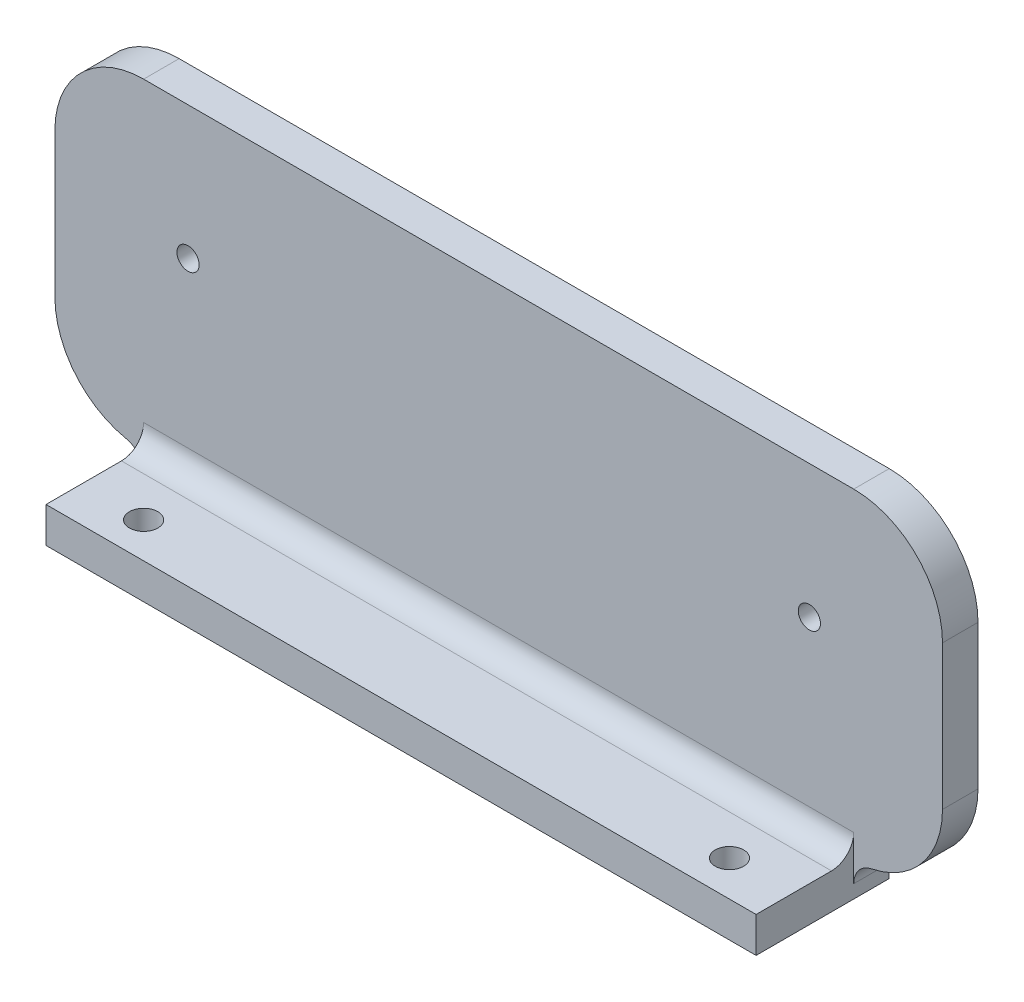
ISO-10303-21;
HEADER;
FILE_DESCRIPTION(('STEP AP214'),'2;1');
FILE_NAME('part.step','',(''),(''),'','','');
FILE_SCHEMA(('AUTOMOTIVE_DESIGN { 1 0 10303 214 1 1 1 1 }'));
ENDSEC;
DATA;
#1=APPLICATION_CONTEXT('core data for automotive mechanical design processes');
#2=APPLICATION_PROTOCOL_DEFINITION('international standard','automotive_design',2000,#1);
#3=PRODUCT_CONTEXT('',#1,'mechanical');
#4=PRODUCT('Part','Part','',(#3));
#5=PRODUCT_RELATED_PRODUCT_CATEGORY('part','',(#4));
#6=PRODUCT_DEFINITION_FORMATION('','',#4);
#7=PRODUCT_DEFINITION_CONTEXT('part definition',#1,'design');
#8=PRODUCT_DEFINITION('design','',#6,#7);
#9=PRODUCT_DEFINITION_SHAPE('','',#8);
#10=(LENGTH_UNIT() NAMED_UNIT(*) SI_UNIT(.MILLI.,.METRE.));
#11=(NAMED_UNIT(*) PLANE_ANGLE_UNIT() SI_UNIT($,.RADIAN.));
#12=(NAMED_UNIT(*) SI_UNIT($,.STERADIAN.) SOLID_ANGLE_UNIT());
#13=UNCERTAINTY_MEASURE_WITH_UNIT(LENGTH_MEASURE(1.E-05),#10,'distance_accuracy_value','');
#14=(GEOMETRIC_REPRESENTATION_CONTEXT(3) GLOBAL_UNCERTAINTY_ASSIGNED_CONTEXT((#13)) GLOBAL_UNIT_ASSIGNED_CONTEXT((#10,
#11,#12)) REPRESENTATION_CONTEXT('',''));
#15=CARTESIAN_POINT('',(0.,0.,0.));
#16=DIRECTION('',(0.,0.,1.));
#17=DIRECTION('',(1.,0.,0.));
#18=AXIS2_PLACEMENT_3D('',#15,#16,#17);
#19=CARTESIAN_POINT('',(50.,18.,4.));
#20=DIRECTION('',(-1.,0.,0.));
#21=DIRECTION('',(0.,-1.,0.));
#22=AXIS2_PLACEMENT_3D('',#19,#20,#21);
#23=PLANE('',#22);
#24=DIRECTION('',(0.,1.,0.));
#25=VECTOR('',#24,1.);
#26=CARTESIAN_POINT('',(50.,18.,4.));
#27=LINE('',#26,#25);
#28=CARTESIAN_POINT('',(50.,-8.2525512860841,4.));
#29=VERTEX_POINT('',#28);
#30=CARTESIAN_POINT('',(50.,7.99999999999999,4.));
#31=VERTEX_POINT('',#30);
#32=EDGE_CURVE('E173',#29,#31,#27,.T.);
#33=ORIENTED_EDGE('',*,*,#32,.F.);
#34=DIRECTION('',(0.,0.,-1.));
#35=VECTOR('',#34,1.);
#36=CARTESIAN_POINT('',(50.,-8.2525512860841,4.));
#37=LINE('',#36,#35);
#38=CARTESIAN_POINT('',(50.,-8.2525512860841,0.));
#39=VERTEX_POINT('',#38);
#40=EDGE_CURVE('E239',#29,#39,#37,.T.);
#41=ORIENTED_EDGE('',*,*,#40,.T.);
#42=DIRECTION('',(0.,1.,0.));
#43=VECTOR('',#42,1.);
#44=CARTESIAN_POINT('',(50.,18.,0.));
#45=LINE('',#44,#43);
#46=CARTESIAN_POINT('',(50.,7.99999999999999,0.));
#47=VERTEX_POINT('',#46);
#48=EDGE_CURVE('E164',#39,#47,#45,.T.);
#49=ORIENTED_EDGE('',*,*,#48,.T.);
#50=DIRECTION('',(0.,0.,-1.));
#51=VECTOR('',#50,1.);
#52=CARTESIAN_POINT('',(50.,7.99999999999999,4.));
#53=LINE('',#52,#51);
#54=EDGE_CURVE('E237',#47,#31,#53,.F.);
#55=ORIENTED_EDGE('',*,*,#54,.T.);
#56=EDGE_LOOP('',(#33,#41,#49,#55));
#57=FACE_BOUND('',#56,.T.);
#58=ADVANCED_FACE('F32',(#57),#23,.F.);
#59=CARTESIAN_POINT('',(-50.,18.,4.));
#60=DIRECTION('',(0.,-1.,0.));
#61=DIRECTION('',(0.,0.,-1.));
#62=AXIS2_PLACEMENT_3D('',#59,#60,#61);
#63=PLANE('',#62);
#64=DIRECTION('',(-1.,0.,0.));
#65=VECTOR('',#64,1.);
#66=CARTESIAN_POINT('',(-50.,18.,0.));
#67=LINE('',#66,#65);
#68=CARTESIAN_POINT('',(40.,18.,0.));
#69=VERTEX_POINT('',#68);
#70=CARTESIAN_POINT('',(-40.,18.,0.));
#71=VERTEX_POINT('',#70);
#72=EDGE_CURVE('E167',#69,#71,#67,.T.);
#73=ORIENTED_EDGE('',*,*,#72,.T.);
#74=DIRECTION('',(0.,0.,-1.));
#75=VECTOR('',#74,1.);
#76=CARTESIAN_POINT('',(-40.,18.,4.));
#77=LINE('',#76,#75);
#78=CARTESIAN_POINT('',(-40.,18.,4.));
#79=VERTEX_POINT('',#78);
#80=EDGE_CURVE('E11',#71,#79,#77,.F.);
#81=ORIENTED_EDGE('',*,*,#80,.T.);
#82=DIRECTION('',(-1.,0.,0.));
#83=VECTOR('',#82,1.);
#84=CARTESIAN_POINT('',(-50.,18.,4.));
#85=LINE('',#84,#83);
#86=CARTESIAN_POINT('',(40.,18.,4.));
#87=VERTEX_POINT('',#86);
#88=EDGE_CURVE('E175',#87,#79,#85,.T.);
#89=ORIENTED_EDGE('',*,*,#88,.F.);
#90=DIRECTION('',(0.,0.,-1.));
#91=VECTOR('',#90,1.);
#92=CARTESIAN_POINT('',(40.,18.,4.));
#93=LINE('',#92,#91);
#94=EDGE_CURVE('E40',#87,#69,#93,.T.);
#95=ORIENTED_EDGE('',*,*,#94,.T.);
#96=EDGE_LOOP('',(#73,#81,#89,#95));
#97=FACE_BOUND('',#96,.T.);
#98=ADVANCED_FACE('F246',(#97),#63,.F.);
#99=CARTESIAN_POINT('',(-50.,18.,4.));
#100=DIRECTION('',(1.,0.,0.));
#101=DIRECTION('',(0.,1.,0.));
#102=AXIS2_PLACEMENT_3D('',#99,#100,#101);
#103=PLANE('',#102);
#104=DIRECTION('',(0.,-1.,0.));
#105=VECTOR('',#104,1.);
#106=CARTESIAN_POINT('',(-50.,18.,0.));
#107=LINE('',#106,#105);
#108=CARTESIAN_POINT('',(-50.,7.99999999999999,0.));
#109=VERTEX_POINT('',#108);
#110=CARTESIAN_POINT('',(-50.,-8.25255128608412,0.));
#111=VERTEX_POINT('',#110);
#112=EDGE_CURVE('E176',#109,#111,#107,.T.);
#113=ORIENTED_EDGE('',*,*,#112,.T.);
#114=DIRECTION('',(0.,0.,1.));
#115=VECTOR('',#114,1.);
#116=CARTESIAN_POINT('',(-50.,-8.25255128608412,4.));
#117=LINE('',#116,#115);
#118=CARTESIAN_POINT('',(-50.,-8.25255128608412,4.));
#119=VERTEX_POINT('',#118);
#120=EDGE_CURVE('E228',#111,#119,#117,.T.);
#121=ORIENTED_EDGE('',*,*,#120,.T.);
#122=DIRECTION('',(0.,-1.,0.));
#123=VECTOR('',#122,1.);
#124=CARTESIAN_POINT('',(-50.,18.,4.));
#125=LINE('',#124,#123);
#126=CARTESIAN_POINT('',(-50.,7.99999999999999,4.));
#127=VERTEX_POINT('',#126);
#128=EDGE_CURVE('E178',#127,#119,#125,.T.);
#129=ORIENTED_EDGE('',*,*,#128,.F.);
#130=DIRECTION('',(0.,0.,-1.));
#131=VECTOR('',#130,1.);
#132=CARTESIAN_POINT('',(-50.,7.99999999999999,4.));
#133=LINE('',#132,#131);
#134=EDGE_CURVE('E225',#127,#109,#133,.T.);
#135=ORIENTED_EDGE('',*,*,#134,.T.);
#136=EDGE_LOOP('',(#113,#121,#129,#135));
#137=FACE_BOUND('',#136,.T.);
#138=ADVANCED_FACE('F258',(#137),#103,.F.);
#139=CARTESIAN_POINT('',(0.,0.,4.));
#140=DIRECTION('',(0.,0.,1.));
#141=DIRECTION('',(1.,0.,0.));
#142=AXIS2_PLACEMENT_3D('',#139,#140,#141);
#143=PLANE('',#142);
#144=CARTESIAN_POINT('',(35.,2.99999999999999,4.));
#145=DIRECTION('',(0.,0.,1.));
#146=DIRECTION('',(1.,0.,0.));
#147=AXIS2_PLACEMENT_3D('',#144,#145,#146);
#148=CIRCLE('',#147,1.25000000000001);
#149=CARTESIAN_POINT('',(36.25,2.99999999999999,4.));
#150=VERTEX_POINT('',#149);
#151=EDGE_CURVE('E290',#150,#150,#148,.T.);
#152=ORIENTED_EDGE('',*,*,#151,.F.);
#153=EDGE_LOOP('',(#152));
#154=FACE_BOUND('',#153,.T.);
#155=CARTESIAN_POINT('',(-35.,2.99999999999999,4.));
#156=DIRECTION('',(0.,0.,1.));
#157=DIRECTION('',(1.,0.,0.));
#158=AXIS2_PLACEMENT_3D('',#155,#156,#157);
#159=CIRCLE('',#158,1.25);
#160=CARTESIAN_POINT('',(-33.75,2.99999999999999,4.));
#161=VERTEX_POINT('',#160);
#162=EDGE_CURVE('E283',#161,#161,#159,.T.);
#163=ORIENTED_EDGE('',*,*,#162,.F.);
#164=EDGE_LOOP('',(#163));
#165=FACE_BOUND('',#164,.T.);
#166=ORIENTED_EDGE('',*,*,#128,.T.);
#167=CARTESIAN_POINT('',(-40.,-8.25255128608412,4.));
#168=DIRECTION('',(0.,0.,1.));
#169=DIRECTION('',(1.,0.,0.));
#170=AXIS2_PLACEMENT_3D('',#167,#168,#169);
#171=CIRCLE('',#170,10.);
#172=CARTESIAN_POINT('',(-42.,-18.0505102572168,4.));
#173=VERTEX_POINT('',#172);
#174=EDGE_CURVE('E235',#119,#173,#171,.T.);
#175=ORIENTED_EDGE('',*,*,#174,.T.);
#176=CARTESIAN_POINT('',(-42.5,-20.5,4.));
#177=DIRECTION('',(0.,0.,1.));
#178=DIRECTION('',(1.,0.,0.));
#179=AXIS2_PLACEMENT_3D('',#176,#177,#178);
#180=CIRCLE('',#179,2.5);
#181=CARTESIAN_POINT('',(-40.,-20.5,4.));
#182=VERTEX_POINT('',#181);
#183=EDGE_CURVE('E212',#173,#182,#180,.F.);
#184=ORIENTED_EDGE('',*,*,#183,.T.);
#185=DIRECTION('',(0.,1.,0.));
#186=VECTOR('',#185,1.);
#187=CARTESIAN_POINT('',(-40.,0.,4.));
#188=LINE('',#187,#186);
#189=CARTESIAN_POINT('',(-40.,-15.5,4.));
#190=VERTEX_POINT('',#189);
#191=EDGE_CURVE('E180',#182,#190,#188,.T.);
#192=ORIENTED_EDGE('',*,*,#191,.T.);
#193=DIRECTION('',(1.,0.,0.));
#194=VECTOR('',#193,1.);
#195=CARTESIAN_POINT('',(0.,-15.5,4.));
#196=LINE('',#195,#194);
#197=CARTESIAN_POINT('',(40.,-15.5,4.));
#198=VERTEX_POINT('',#197);
#199=EDGE_CURVE('E187',#190,#198,#196,.T.);
#200=ORIENTED_EDGE('',*,*,#199,.T.);
#201=DIRECTION('',(0.,-1.,0.));
#202=VECTOR('',#201,1.);
#203=CARTESIAN_POINT('',(40.,0.,4.));
#204=LINE('',#203,#202);
#205=CARTESIAN_POINT('',(40.,-20.5,4.));
#206=VERTEX_POINT('',#205);
#207=EDGE_CURVE('E190',#198,#206,#204,.T.);
#208=ORIENTED_EDGE('',*,*,#207,.T.);
#209=CARTESIAN_POINT('',(42.5,-20.5,4.));
#210=DIRECTION('',(0.,0.,1.));
#211=DIRECTION('',(1.,0.,0.));
#212=AXIS2_PLACEMENT_3D('',#209,#210,#211);
#213=CIRCLE('',#212,2.5);
#214=CARTESIAN_POINT('',(42.,-18.0505102572168,4.));
#215=VERTEX_POINT('',#214);
#216=EDGE_CURVE('E204',#206,#215,#213,.F.);
#217=ORIENTED_EDGE('',*,*,#216,.T.);
#218=CARTESIAN_POINT('',(40.,-8.2525512860841,4.));
#219=DIRECTION('',(0.,0.,1.));
#220=DIRECTION('',(1.,0.,0.));
#221=AXIS2_PLACEMENT_3D('',#218,#219,#220);
#222=CIRCLE('',#221,10.);
#223=EDGE_CURVE('E233',#215,#29,#222,.T.);
#224=ORIENTED_EDGE('',*,*,#223,.T.);
#225=ORIENTED_EDGE('',*,*,#32,.T.);
#226=CARTESIAN_POINT('',(40.,7.99999999999999,4.));
#227=DIRECTION('',(0.,0.,1.));
#228=DIRECTION('',(1.,0.,0.));
#229=AXIS2_PLACEMENT_3D('',#226,#227,#228);
#230=CIRCLE('',#229,10.);
#231=EDGE_CURVE('E52',#31,#87,#230,.T.);
#232=ORIENTED_EDGE('',*,*,#231,.T.);
#233=ORIENTED_EDGE('',*,*,#88,.T.);
#234=CARTESIAN_POINT('',(-40.,7.99999999999999,4.));
#235=DIRECTION('',(0.,0.,1.));
#236=DIRECTION('',(1.,0.,0.));
#237=AXIS2_PLACEMENT_3D('',#234,#235,#236);
#238=CIRCLE('',#237,10.);
#239=EDGE_CURVE('E231',#79,#127,#238,.T.);
#240=ORIENTED_EDGE('',*,*,#239,.T.);
#241=EDGE_LOOP('',(#166,#175,#184,#192,#200,#208,#217,#224,#225,#232,#233,#240));
#242=FACE_BOUND('',#241,.T.);
#243=ADVANCED_FACE('F261',(#154,#165,#242),#143,.T.);
#244=CARTESIAN_POINT('',(0.,0.,0.));
#245=DIRECTION('',(0.,0.,1.));
#246=DIRECTION('',(1.,0.,0.));
#247=AXIS2_PLACEMENT_3D('',#244,#245,#246);
#248=PLANE('',#247);
#249=CARTESIAN_POINT('',(35.,2.99999999999999,0.));
#250=DIRECTION('',(0.,0.,1.));
#251=DIRECTION('',(1.,0.,0.));
#252=AXIS2_PLACEMENT_3D('',#249,#250,#251);
#253=CIRCLE('',#252,1.25000000000001);
#254=CARTESIAN_POINT('',(36.25,2.99999999999999,0.));
#255=VERTEX_POINT('',#254);
#256=EDGE_CURVE('E280',#255,#255,#253,.T.);
#257=ORIENTED_EDGE('',*,*,#256,.T.);
#258=EDGE_LOOP('',(#257));
#259=FACE_BOUND('',#258,.T.);
#260=CARTESIAN_POINT('',(-35.,2.99999999999999,0.));
#261=DIRECTION('',(0.,0.,1.));
#262=DIRECTION('',(1.,0.,0.));
#263=AXIS2_PLACEMENT_3D('',#260,#261,#262);
#264=CIRCLE('',#263,1.25);
#265=CARTESIAN_POINT('',(-33.75,2.99999999999999,0.));
#266=VERTEX_POINT('',#265);
#267=EDGE_CURVE('E286',#266,#266,#264,.T.);
#268=ORIENTED_EDGE('',*,*,#267,.T.);
#269=EDGE_LOOP('',(#268));
#270=FACE_BOUND('',#269,.T.);
#271=CARTESIAN_POINT('',(-42.5,-20.5,0.));
#272=DIRECTION('',(0.,0.,1.));
#273=DIRECTION('',(1.,0.,0.));
#274=AXIS2_PLACEMENT_3D('',#271,#272,#273);
#275=CIRCLE('',#274,2.5);
#276=CARTESIAN_POINT('',(-40.,-20.5,0.));
#277=VERTEX_POINT('',#276);
#278=CARTESIAN_POINT('',(-42.,-18.0505102572168,0.));
#279=VERTEX_POINT('',#278);
#280=EDGE_CURVE('E209',#277,#279,#275,.T.);
#281=ORIENTED_EDGE('',*,*,#280,.T.);
#282=CARTESIAN_POINT('',(-40.,-8.25255128608412,0.));
#283=DIRECTION('',(0.,0.,1.));
#284=DIRECTION('',(1.,0.,0.));
#285=AXIS2_PLACEMENT_3D('',#282,#283,#284);
#286=CIRCLE('',#285,10.);
#287=EDGE_CURVE('E223',#279,#111,#286,.F.);
#288=ORIENTED_EDGE('',*,*,#287,.T.);
#289=ORIENTED_EDGE('',*,*,#112,.F.);
#290=CARTESIAN_POINT('',(-40.,7.99999999999999,0.));
#291=DIRECTION('',(0.,0.,1.));
#292=DIRECTION('',(1.,0.,0.));
#293=AXIS2_PLACEMENT_3D('',#290,#291,#292);
#294=CIRCLE('',#293,10.);
#295=EDGE_CURVE('E219',#109,#71,#294,.F.);
#296=ORIENTED_EDGE('',*,*,#295,.T.);
#297=ORIENTED_EDGE('',*,*,#72,.F.);
#298=CARTESIAN_POINT('',(40.,7.99999999999999,0.));
#299=DIRECTION('',(0.,0.,1.));
#300=DIRECTION('',(1.,0.,0.));
#301=AXIS2_PLACEMENT_3D('',#298,#299,#300);
#302=CIRCLE('',#301,10.);
#303=EDGE_CURVE('E217',#69,#47,#302,.F.);
#304=ORIENTED_EDGE('',*,*,#303,.T.);
#305=ORIENTED_EDGE('',*,*,#48,.F.);
#306=CARTESIAN_POINT('',(40.,-8.2525512860841,0.));
#307=DIRECTION('',(0.,0.,1.));
#308=DIRECTION('',(1.,0.,0.));
#309=AXIS2_PLACEMENT_3D('',#306,#307,#308);
#310=CIRCLE('',#309,10.);
#311=CARTESIAN_POINT('',(42.,-18.0505102572168,0.));
#312=VERTEX_POINT('',#311);
#313=EDGE_CURVE('E221',#39,#312,#310,.F.);
#314=ORIENTED_EDGE('',*,*,#313,.T.);
#315=CARTESIAN_POINT('',(42.5,-20.5,0.));
#316=DIRECTION('',(0.,0.,1.));
#317=DIRECTION('',(1.,0.,0.));
#318=AXIS2_PLACEMENT_3D('',#315,#316,#317);
#319=CIRCLE('',#318,2.5);
#320=CARTESIAN_POINT('',(40.,-20.5,0.));
#321=VERTEX_POINT('',#320);
#322=EDGE_CURVE('E207',#312,#321,#319,.T.);
#323=ORIENTED_EDGE('',*,*,#322,.T.);
#324=DIRECTION('',(0.,1.,0.));
#325=VECTOR('',#324,1.);
#326=CARTESIAN_POINT('',(40.,-22.,0.));
#327=LINE('',#326,#325);
#328=CARTESIAN_POINT('',(40.,-22.,0.));
#329=VERTEX_POINT('',#328);
#330=EDGE_CURVE('E272',#329,#321,#327,.T.);
#331=ORIENTED_EDGE('',*,*,#330,.F.);
#332=DIRECTION('',(1.,0.,0.));
#333=VECTOR('',#332,1.);
#334=CARTESIAN_POINT('',(-40.,-22.,0.));
#335=LINE('',#334,#333);
#336=CARTESIAN_POINT('',(-40.,-22.,0.));
#337=VERTEX_POINT('',#336);
#338=EDGE_CURVE('E154',#337,#329,#335,.T.);
#339=ORIENTED_EDGE('',*,*,#338,.F.);
#340=DIRECTION('',(0.,1.,0.));
#341=VECTOR('',#340,1.);
#342=CARTESIAN_POINT('',(-40.,-22.,0.));
#343=LINE('',#342,#341);
#344=EDGE_CURVE('E169',#337,#277,#343,.T.);
#345=ORIENTED_EDGE('',*,*,#344,.T.);
#346=EDGE_LOOP('',(#281,#288,#289,#296,#297,#304,#305,#314,#323,#331,#339,#345));
#347=FACE_BOUND('',#346,.T.);
#348=ADVANCED_FACE('F249',(#259,#270,#347),#248,.F.);
#349=CARTESIAN_POINT('',(40.,-22.,15.));
#350=DIRECTION('',(-1.,0.,0.));
#351=DIRECTION('',(0.,0.,1.));
#352=AXIS2_PLACEMENT_3D('',#349,#350,#351);
#353=PLANE('',#352);
#354=ORIENTED_EDGE('',*,*,#330,.T.);
#355=DIRECTION('',(0.,0.,1.));
#356=VECTOR('',#355,1.);
#357=CARTESIAN_POINT('',(40.,-20.5,4.));
#358=LINE('',#357,#356);
#359=EDGE_CURVE('E198',#321,#206,#358,.T.);
#360=ORIENTED_EDGE('',*,*,#359,.T.);
#361=ORIENTED_EDGE('',*,*,#207,.F.);
#362=CARTESIAN_POINT('',(40.,-15.5,6.5));
#363=DIRECTION('',(-1.,0.,0.));
#364=DIRECTION('',(0.,0.,1.));
#365=AXIS2_PLACEMENT_3D('',#362,#363,#364);
#366=CIRCLE('',#365,2.5);
#367=CARTESIAN_POINT('',(40.,-18.,6.5));
#368=VERTEX_POINT('',#367);
#369=EDGE_CURVE('E194',#198,#368,#366,.T.);
#370=ORIENTED_EDGE('',*,*,#369,.T.);
#371=DIRECTION('',(0.,0.,1.));
#372=VECTOR('',#371,1.);
#373=CARTESIAN_POINT('',(40.,-18.,15.));
#374=LINE('',#373,#372);
#375=CARTESIAN_POINT('',(40.,-18.,15.));
#376=VERTEX_POINT('',#375);
#377=EDGE_CURVE('E162',#368,#376,#374,.T.);
#378=ORIENTED_EDGE('',*,*,#377,.T.);
#379=DIRECTION('',(0.,1.,0.));
#380=VECTOR('',#379,1.);
#381=CARTESIAN_POINT('',(40.,-22.,15.));
#382=LINE('',#381,#380);
#383=CARTESIAN_POINT('',(40.,-22.,15.));
#384=VERTEX_POINT('',#383);
#385=EDGE_CURVE('E143',#384,#376,#382,.T.);
#386=ORIENTED_EDGE('',*,*,#385,.F.);
#387=DIRECTION('',(0.,0.,1.));
#388=VECTOR('',#387,1.);
#389=CARTESIAN_POINT('',(40.,-22.,15.));
#390=LINE('',#389,#388);
#391=EDGE_CURVE('E149',#329,#384,#390,.T.);
#392=ORIENTED_EDGE('',*,*,#391,.F.);
#393=EDGE_LOOP('',(#354,#360,#361,#370,#378,#386,#392));
#394=FACE_BOUND('',#393,.T.);
#395=ADVANCED_FACE('F160',(#394),#353,.F.);
#396=CARTESIAN_POINT('',(-40.,-22.,15.));
#397=DIRECTION('',(0.,0.,-1.));
#398=DIRECTION('',(-1.,0.,0.));
#399=AXIS2_PLACEMENT_3D('',#396,#397,#398);
#400=PLANE('',#399);
#401=DIRECTION('',(-1.,0.,0.));
#402=VECTOR('',#401,1.);
#403=CARTESIAN_POINT('',(-40.,-18.,15.));
#404=LINE('',#403,#402);
#405=CARTESIAN_POINT('',(-40.,-18.,15.));
#406=VERTEX_POINT('',#405);
#407=EDGE_CURVE('E277',#376,#406,#404,.T.);
#408=ORIENTED_EDGE('',*,*,#407,.T.);
#409=DIRECTION('',(0.,1.,0.));
#410=VECTOR('',#409,1.);
#411=CARTESIAN_POINT('',(-40.,-22.,15.));
#412=LINE('',#411,#410);
#413=CARTESIAN_POINT('',(-40.,-22.,15.));
#414=VERTEX_POINT('',#413);
#415=EDGE_CURVE('E145',#414,#406,#412,.T.);
#416=ORIENTED_EDGE('',*,*,#415,.F.);
#417=DIRECTION('',(-1.,0.,0.));
#418=VECTOR('',#417,1.);
#419=CARTESIAN_POINT('',(-40.,-22.,15.));
#420=LINE('',#419,#418);
#421=EDGE_CURVE('E139',#384,#414,#420,.T.);
#422=ORIENTED_EDGE('',*,*,#421,.F.);
#423=ORIENTED_EDGE('',*,*,#385,.T.);
#424=EDGE_LOOP('',(#408,#416,#422,#423));
#425=FACE_BOUND('',#424,.T.);
#426=ADVANCED_FACE('F141',(#425),#400,.F.);
#427=CARTESIAN_POINT('',(-40.,-22.,15.));
#428=DIRECTION('',(1.,0.,0.));
#429=DIRECTION('',(0.,0.,-1.));
#430=AXIS2_PLACEMENT_3D('',#427,#428,#429);
#431=PLANE('',#430);
#432=ORIENTED_EDGE('',*,*,#191,.F.);
#433=DIRECTION('',(0.,0.,-1.));
#434=VECTOR('',#433,1.);
#435=CARTESIAN_POINT('',(-40.,-20.5,0.));
#436=LINE('',#435,#434);
#437=EDGE_CURVE('E201',#182,#277,#436,.T.);
#438=ORIENTED_EDGE('',*,*,#437,.T.);
#439=ORIENTED_EDGE('',*,*,#344,.F.);
#440=DIRECTION('',(0.,0.,-1.));
#441=VECTOR('',#440,1.);
#442=CARTESIAN_POINT('',(-40.,-22.,15.));
#443=LINE('',#442,#441);
#444=EDGE_CURVE('E148',#414,#337,#443,.T.);
#445=ORIENTED_EDGE('',*,*,#444,.F.);
#446=ORIENTED_EDGE('',*,*,#415,.T.);
#447=DIRECTION('',(0.,0.,-1.));
#448=VECTOR('',#447,1.);
#449=CARTESIAN_POINT('',(-40.,-18.,15.));
#450=LINE('',#449,#448);
#451=CARTESIAN_POINT('',(-40.,-18.,6.5));
#452=VERTEX_POINT('',#451);
#453=EDGE_CURVE('E158',#406,#452,#450,.T.);
#454=ORIENTED_EDGE('',*,*,#453,.T.);
#455=CARTESIAN_POINT('',(-40.,-15.5,6.5));
#456=DIRECTION('',(1.,0.,0.));
#457=DIRECTION('',(0.,0.,-1.));
#458=AXIS2_PLACEMENT_3D('',#455,#456,#457);
#459=CIRCLE('',#458,2.5);
#460=EDGE_CURVE('E196',#452,#190,#459,.T.);
#461=ORIENTED_EDGE('',*,*,#460,.T.);
#462=EDGE_LOOP('',(#432,#438,#439,#445,#446,#454,#461));
#463=FACE_BOUND('',#462,.T.);
#464=ADVANCED_FACE('F319',(#463),#431,.F.);
#465=CARTESIAN_POINT('',(0.,-22.,0.));
#466=DIRECTION('',(0.,-1.,0.));
#467=DIRECTION('',(0.,0.,-1.));
#468=AXIS2_PLACEMENT_3D('',#465,#466,#467);
#469=PLANE('',#468);
#470=CARTESIAN_POINT('',(33.,-22.,11.));
#471=DIRECTION('',(0.,-1.,0.));
#472=DIRECTION('',(0.,0.,-1.));
#473=AXIS2_PLACEMENT_3D('',#470,#471,#472);
#474=CIRCLE('',#473,1.6);
#475=CARTESIAN_POINT('',(33.,-22.,9.4));
#476=VERTEX_POINT('',#475);
#477=EDGE_CURVE('E301',#476,#476,#474,.T.);
#478=ORIENTED_EDGE('',*,*,#477,.F.);
#479=EDGE_LOOP('',(#478));
#480=FACE_BOUND('',#479,.T.);
#481=CARTESIAN_POINT('',(-33.,-22.,11.));
#482=DIRECTION('',(0.,-1.,0.));
#483=DIRECTION('',(0.,0.,-1.));
#484=AXIS2_PLACEMENT_3D('',#481,#482,#483);
#485=CIRCLE('',#484,1.6);
#486=CARTESIAN_POINT('',(-33.,-22.,9.4));
#487=VERTEX_POINT('',#486);
#488=EDGE_CURVE('E295',#487,#487,#485,.T.);
#489=ORIENTED_EDGE('',*,*,#488,.F.);
#490=EDGE_LOOP('',(#489));
#491=FACE_BOUND('',#490,.T.);
#492=ORIENTED_EDGE('',*,*,#391,.T.);
#493=ORIENTED_EDGE('',*,*,#421,.T.);
#494=ORIENTED_EDGE('',*,*,#444,.T.);
#495=ORIENTED_EDGE('',*,*,#338,.T.);
#496=EDGE_LOOP('',(#492,#493,#494,#495));
#497=FACE_BOUND('',#496,.T.);
#498=ADVANCED_FACE('F152',(#480,#491,#497),#469,.T.);
#499=CARTESIAN_POINT('',(0.,-18.,0.));
#500=DIRECTION('',(0.,-1.,0.));
#501=DIRECTION('',(0.,0.,-1.));
#502=AXIS2_PLACEMENT_3D('',#499,#500,#501);
#503=PLANE('',#502);
#504=CARTESIAN_POINT('',(33.,-18.,11.));
#505=DIRECTION('',(0.,-1.,0.));
#506=DIRECTION('',(0.,0.,-1.));
#507=AXIS2_PLACEMENT_3D('',#504,#505,#506);
#508=CIRCLE('',#507,1.6);
#509=CARTESIAN_POINT('',(33.,-18.,9.4));
#510=VERTEX_POINT('',#509);
#511=EDGE_CURVE('E287',#510,#510,#508,.T.);
#512=ORIENTED_EDGE('',*,*,#511,.T.);
#513=EDGE_LOOP('',(#512));
#514=FACE_BOUND('',#513,.T.);
#515=CARTESIAN_POINT('',(-33.,-18.,11.));
#516=DIRECTION('',(0.,-1.,0.));
#517=DIRECTION('',(0.,0.,-1.));
#518=AXIS2_PLACEMENT_3D('',#515,#516,#517);
#519=CIRCLE('',#518,1.6);
#520=CARTESIAN_POINT('',(-33.,-18.,9.4));
#521=VERTEX_POINT('',#520);
#522=EDGE_CURVE('E298',#521,#521,#519,.T.);
#523=ORIENTED_EDGE('',*,*,#522,.T.);
#524=EDGE_LOOP('',(#523));
#525=FACE_BOUND('',#524,.T.);
#526=ORIENTED_EDGE('',*,*,#377,.F.);
#527=DIRECTION('',(1.,0.,0.));
#528=VECTOR('',#527,1.);
#529=CARTESIAN_POINT('',(0.,-18.,6.5));
#530=LINE('',#529,#528);
#531=EDGE_CURVE('E192',#368,#452,#530,.F.);
#532=ORIENTED_EDGE('',*,*,#531,.T.);
#533=ORIENTED_EDGE('',*,*,#453,.F.);
#534=ORIENTED_EDGE('',*,*,#407,.F.);
#535=EDGE_LOOP('',(#526,#532,#533,#534));
#536=FACE_BOUND('',#535,.T.);
#537=ADVANCED_FACE('F307',(#514,#525,#536),#503,.F.);
#538=CARTESIAN_POINT('',(-35.,2.99999999999999,0.));
#539=DIRECTION('',(0.,0.,1.));
#540=DIRECTION('',(1.,0.,0.));
#541=AXIS2_PLACEMENT_3D('',#538,#539,#540);
#542=CYLINDRICAL_SURFACE('',#541,1.25);
#543=ORIENTED_EDGE('',*,*,#267,.F.);
#544=EDGE_LOOP('',(#543));
#545=FACE_BOUND('',#544,.T.);
#546=ORIENTED_EDGE('',*,*,#162,.T.);
#547=EDGE_LOOP('',(#546));
#548=FACE_BOUND('',#547,.T.);
#549=ADVANCED_FACE('F383',(#545,#548),#542,.F.);
#550=CARTESIAN_POINT('',(35.,2.99999999999999,0.));
#551=DIRECTION('',(0.,0.,1.));
#552=DIRECTION('',(1.,0.,0.));
#553=AXIS2_PLACEMENT_3D('',#550,#551,#552);
#554=CYLINDRICAL_SURFACE('',#553,1.25000000000001);
#555=ORIENTED_EDGE('',*,*,#256,.F.);
#556=EDGE_LOOP('',(#555));
#557=FACE_BOUND('',#556,.T.);
#558=ORIENTED_EDGE('',*,*,#151,.T.);
#559=EDGE_LOOP('',(#558));
#560=FACE_BOUND('',#559,.T.);
#561=ADVANCED_FACE('F345',(#557,#560),#554,.F.);
#562=CARTESIAN_POINT('',(0.,-15.5,6.5));
#563=DIRECTION('',(1.,0.,0.));
#564=DIRECTION('',(0.,0.,-1.));
#565=AXIS2_PLACEMENT_3D('',#562,#563,#564);
#566=CYLINDRICAL_SURFACE('',#565,2.5);
#567=ORIENTED_EDGE('',*,*,#460,.F.);
#568=ORIENTED_EDGE('',*,*,#531,.F.);
#569=ORIENTED_EDGE('',*,*,#369,.F.);
#570=ORIENTED_EDGE('',*,*,#199,.F.);
#571=EDGE_LOOP('',(#567,#568,#569,#570));
#572=FACE_BOUND('',#571,.T.);
#573=ADVANCED_FACE('F341',(#572),#566,.F.);
#574=CARTESIAN_POINT('',(42.5,-20.5,15.));
#575=DIRECTION('',(0.,0.,-1.));
#576=DIRECTION('',(-1.,0.,0.));
#577=AXIS2_PLACEMENT_3D('',#574,#575,#576);
#578=CYLINDRICAL_SURFACE('',#577,2.5);
#579=ORIENTED_EDGE('',*,*,#322,.F.);
#580=DIRECTION('',(0.,0.,-1.));
#581=VECTOR('',#580,1.);
#582=CARTESIAN_POINT('',(42.,-18.0505102572168,15.));
#583=LINE('',#582,#581);
#584=EDGE_CURVE('E242',#312,#215,#583,.F.);
#585=ORIENTED_EDGE('',*,*,#584,.T.);
#586=ORIENTED_EDGE('',*,*,#216,.F.);
#587=ORIENTED_EDGE('',*,*,#359,.F.);
#588=EDGE_LOOP('',(#579,#585,#586,#587));
#589=FACE_BOUND('',#588,.T.);
#590=ADVANCED_FACE('F344',(#589),#578,.F.);
#591=CARTESIAN_POINT('',(-42.5,-20.5,15.));
#592=DIRECTION('',(0.,0.,1.));
#593=DIRECTION('',(1.,0.,0.));
#594=AXIS2_PLACEMENT_3D('',#591,#592,#593);
#595=CYLINDRICAL_SURFACE('',#594,2.5);
#596=ORIENTED_EDGE('',*,*,#183,.F.);
#597=DIRECTION('',(0.,0.,1.));
#598=VECTOR('',#597,1.);
#599=CARTESIAN_POINT('',(-42.,-18.0505102572168,15.));
#600=LINE('',#599,#598);
#601=EDGE_CURVE('E214',#173,#279,#600,.F.);
#602=ORIENTED_EDGE('',*,*,#601,.T.);
#603=ORIENTED_EDGE('',*,*,#280,.F.);
#604=ORIENTED_EDGE('',*,*,#437,.F.);
#605=EDGE_LOOP('',(#596,#602,#603,#604));
#606=FACE_BOUND('',#605,.T.);
#607=ADVANCED_FACE('F267',(#606),#595,.F.);
#608=CARTESIAN_POINT('',(-40.,-8.25255128608412,15.));
#609=DIRECTION('',(0.,0.,1.));
#610=DIRECTION('',(1.,0.,0.));
#611=AXIS2_PLACEMENT_3D('',#608,#609,#610);
#612=CYLINDRICAL_SURFACE('',#611,10.);
#613=ORIENTED_EDGE('',*,*,#174,.F.);
#614=ORIENTED_EDGE('',*,*,#120,.F.);
#615=ORIENTED_EDGE('',*,*,#287,.F.);
#616=ORIENTED_EDGE('',*,*,#601,.F.);
#617=EDGE_LOOP('',(#613,#614,#615,#616));
#618=FACE_BOUND('',#617,.T.);
#619=ADVANCED_FACE('F265',(#618),#612,.T.);
#620=CARTESIAN_POINT('',(40.,-8.2525512860841,15.));
#621=DIRECTION('',(0.,0.,-1.));
#622=DIRECTION('',(-1.,0.,0.));
#623=AXIS2_PLACEMENT_3D('',#620,#621,#622);
#624=CYLINDRICAL_SURFACE('',#623,10.);
#625=ORIENTED_EDGE('',*,*,#223,.F.);
#626=ORIENTED_EDGE('',*,*,#584,.F.);
#627=ORIENTED_EDGE('',*,*,#313,.F.);
#628=ORIENTED_EDGE('',*,*,#40,.F.);
#629=EDGE_LOOP('',(#625,#626,#627,#628));
#630=FACE_BOUND('',#629,.T.);
#631=ADVANCED_FACE('F354',(#630),#624,.T.);
#632=CARTESIAN_POINT('',(-40.,7.99999999999999,4.));
#633=DIRECTION('',(0.,0.,-1.));
#634=DIRECTION('',(-1.,0.,0.));
#635=AXIS2_PLACEMENT_3D('',#632,#633,#634);
#636=CYLINDRICAL_SURFACE('',#635,10.);
#637=ORIENTED_EDGE('',*,*,#239,.F.);
#638=ORIENTED_EDGE('',*,*,#80,.F.);
#639=ORIENTED_EDGE('',*,*,#295,.F.);
#640=ORIENTED_EDGE('',*,*,#134,.F.);
#641=EDGE_LOOP('',(#637,#638,#639,#640));
#642=FACE_BOUND('',#641,.T.);
#643=ADVANCED_FACE('F255',(#642),#636,.T.);
#644=CARTESIAN_POINT('',(40.,7.99999999999999,4.));
#645=DIRECTION('',(0.,0.,-1.));
#646=DIRECTION('',(-1.,0.,0.));
#647=AXIS2_PLACEMENT_3D('',#644,#645,#646);
#648=CYLINDRICAL_SURFACE('',#647,10.);
#649=ORIENTED_EDGE('',*,*,#231,.F.);
#650=ORIENTED_EDGE('',*,*,#54,.F.);
#651=ORIENTED_EDGE('',*,*,#303,.F.);
#652=ORIENTED_EDGE('',*,*,#94,.F.);
#653=EDGE_LOOP('',(#649,#650,#651,#652));
#654=FACE_BOUND('',#653,.T.);
#655=ADVANCED_FACE('F34',(#654),#648,.T.);
#656=CARTESIAN_POINT('',(-33.,-18.,11.));
#657=DIRECTION('',(0.,-1.,0.));
#658=DIRECTION('',(0.,0.,-1.));
#659=AXIS2_PLACEMENT_3D('',#656,#657,#658);
#660=CYLINDRICAL_SURFACE('',#659,1.6);
#661=ORIENTED_EDGE('',*,*,#522,.F.);
#662=EDGE_LOOP('',(#661));
#663=FACE_BOUND('',#662,.T.);
#664=ORIENTED_EDGE('',*,*,#488,.T.);
#665=EDGE_LOOP('',(#664));
#666=FACE_BOUND('',#665,.T.);
#667=ADVANCED_FACE('F313',(#663,#666),#660,.F.);
#668=CARTESIAN_POINT('',(33.,-18.,11.));
#669=DIRECTION('',(0.,-1.,0.));
#670=DIRECTION('',(0.,0.,-1.));
#671=AXIS2_PLACEMENT_3D('',#668,#669,#670);
#672=CYLINDRICAL_SURFACE('',#671,1.6);
#673=ORIENTED_EDGE('',*,*,#511,.F.);
#674=EDGE_LOOP('',(#673));
#675=FACE_BOUND('',#674,.T.);
#676=ORIENTED_EDGE('',*,*,#477,.T.);
#677=EDGE_LOOP('',(#676));
#678=FACE_BOUND('',#677,.T.);
#679=ADVANCED_FACE('F310',(#675,#678),#672,.F.);
#680=CLOSED_SHELL('',(#58,#98,#138,#243,#348,#395,#426,#464,#498,#537,#549,#561,#573,#590,#607,
#619,#631,#643,#655,#667,#679));
#681=MANIFOLD_SOLID_BREP('B2',#680);
#682=ADVANCED_BREP_SHAPE_REPRESENTATION('',(#18,#681),#14);
#683=SHAPE_DEFINITION_REPRESENTATION(#9,#682);
ENDSEC;
END-ISO-10303-21;
